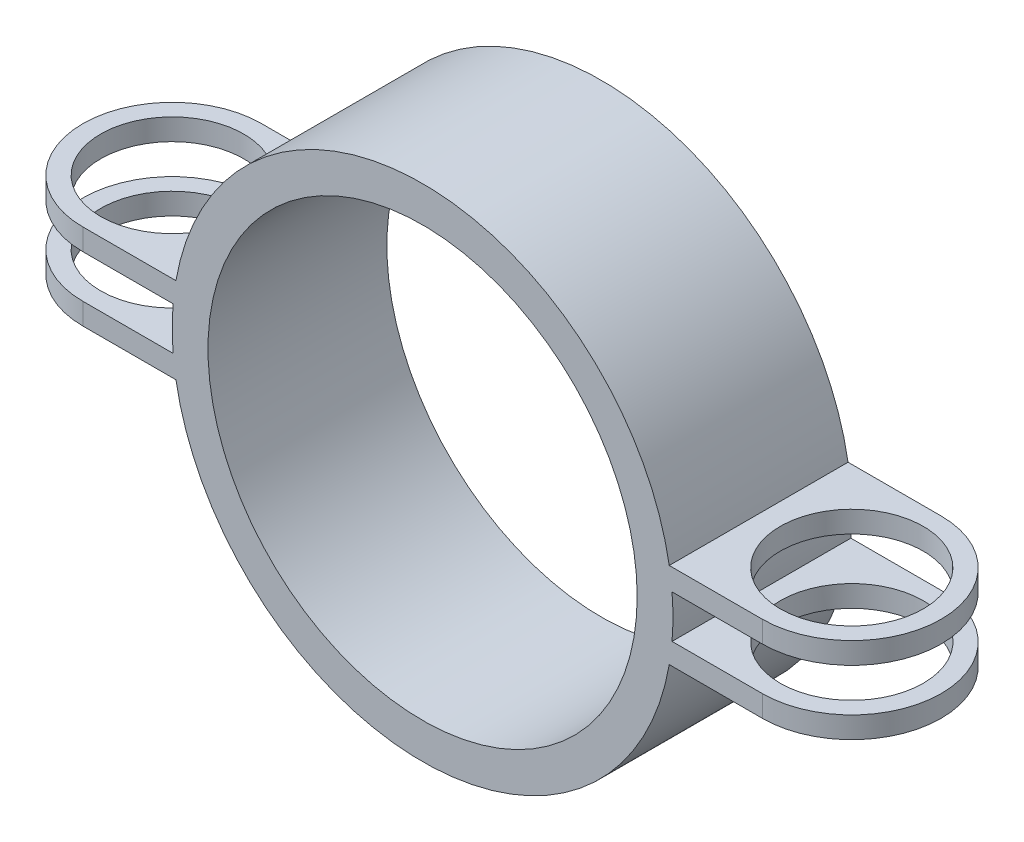
ISO-10303-21;
HEADER;
FILE_DESCRIPTION(('STEP AP214'),'2;1');
FILE_NAME('part.step','',(''),(''),'','','');
FILE_SCHEMA(('AUTOMOTIVE_DESIGN { 1 0 10303 214 1 1 1 1 }'));
ENDSEC;
DATA;
#1=APPLICATION_CONTEXT('core data for automotive mechanical design processes');
#2=APPLICATION_PROTOCOL_DEFINITION('international standard','automotive_design',2000,#1);
#3=PRODUCT_CONTEXT('',#1,'mechanical');
#4=PRODUCT('Part','Part','',(#3));
#5=PRODUCT_RELATED_PRODUCT_CATEGORY('part','',(#4));
#6=PRODUCT_DEFINITION_FORMATION('','',#4);
#7=PRODUCT_DEFINITION_CONTEXT('part definition',#1,'design');
#8=PRODUCT_DEFINITION('design','',#6,#7);
#9=PRODUCT_DEFINITION_SHAPE('','',#8);
#10=(LENGTH_UNIT() NAMED_UNIT(*) SI_UNIT(.MILLI.,.METRE.));
#11=(NAMED_UNIT(*) PLANE_ANGLE_UNIT() SI_UNIT($,.RADIAN.));
#12=(NAMED_UNIT(*) SI_UNIT($,.STERADIAN.) SOLID_ANGLE_UNIT());
#13=UNCERTAINTY_MEASURE_WITH_UNIT(LENGTH_MEASURE(1.E-05),#10,'distance_accuracy_value','');
#14=(GEOMETRIC_REPRESENTATION_CONTEXT(3) GLOBAL_UNCERTAINTY_ASSIGNED_CONTEXT((#13)) GLOBAL_UNIT_ASSIGNED_CONTEXT((#10,
#11,#12)) REPRESENTATION_CONTEXT('',''));
#15=CARTESIAN_POINT('',(0.,0.,0.));
#16=DIRECTION('',(0.,0.,1.));
#17=DIRECTION('',(1.,0.,0.));
#18=AXIS2_PLACEMENT_3D('',#15,#16,#17);
#19=CARTESIAN_POINT('',(0.,0.,-25.));
#20=DIRECTION('',(0.,0.,1.));
#21=DIRECTION('',(1.,0.,0.));
#22=AXIS2_PLACEMENT_3D('',#19,#20,#21);
#23=CYLINDRICAL_SURFACE('',#22,35.);
#24=CARTESIAN_POINT('',(0.,0.,0.));
#25=DIRECTION('',(0.,0.,1.));
#26=DIRECTION('',(1.,0.,0.));
#27=AXIS2_PLACEMENT_3D('',#24,#25,#26);
#28=CIRCLE('',#27,35.);
#29=CARTESIAN_POINT('',(34.8711915483254,-3.,0.));
#30=VERTEX_POINT('',#29);
#31=CARTESIAN_POINT('',(34.8711915483254,3.,0.));
#32=VERTEX_POINT('',#31);
#33=EDGE_CURVE('E282',#30,#32,#28,.T.);
#34=ORIENTED_EDGE('',*,*,#33,.F.);
#35=DIRECTION('',(0.,0.,1.));
#36=VECTOR('',#35,1.);
#37=CARTESIAN_POINT('',(34.8711915483254,-3.,-25.));
#38=LINE('',#37,#36);
#39=CARTESIAN_POINT('',(34.8711915483254,-3.,-25.));
#40=VERTEX_POINT('',#39);
#41=EDGE_CURVE('E52',#40,#30,#38,.T.);
#42=ORIENTED_EDGE('',*,*,#41,.F.);
#43=CARTESIAN_POINT('',(0.,0.,-25.));
#44=DIRECTION('',(0.,0.,1.));
#45=DIRECTION('',(1.,0.,0.));
#46=AXIS2_PLACEMENT_3D('',#43,#44,#45);
#47=CIRCLE('',#46,35.);
#48=CARTESIAN_POINT('',(34.8711915483254,3.,-25.));
#49=VERTEX_POINT('',#48);
#50=EDGE_CURVE('E280',#40,#49,#47,.T.);
#51=ORIENTED_EDGE('',*,*,#50,.T.);
#52=DIRECTION('',(0.,0.,1.));
#53=VECTOR('',#52,1.);
#54=CARTESIAN_POINT('',(34.8711915483254,3.,-25.));
#55=LINE('',#54,#53);
#56=EDGE_CURVE('E202',#32,#49,#55,.F.);
#57=ORIENTED_EDGE('',*,*,#56,.F.);
#58=EDGE_LOOP('',(#34,#42,#51,#57));
#59=FACE_BOUND('',#58,.T.);
#60=ADVANCED_FACE('F36',(#59),#23,.T.);
#61=CARTESIAN_POINT('',(-34.4818792991333,-6.,-25.));
#62=VERTEX_POINT('',#61);
#63=CARTESIAN_POINT('',(34.4818792991333,-6.,-25.));
#64=VERTEX_POINT('',#63);
#65=EDGE_CURVE('E44',#62,#64,#47,.T.);
#66=ORIENTED_EDGE('',*,*,#65,.T.);
#67=DIRECTION('',(0.,0.,1.));
#68=VECTOR('',#67,1.);
#69=CARTESIAN_POINT('',(34.4818792991333,-6.,-25.));
#70=LINE('',#69,#68);
#71=CARTESIAN_POINT('',(34.4818792991333,-6.,0.));
#72=VERTEX_POINT('',#71);
#73=EDGE_CURVE('E182',#72,#64,#70,.F.);
#74=ORIENTED_EDGE('',*,*,#73,.F.);
#75=CARTESIAN_POINT('',(-34.4818792991333,-6.,0.));
#76=VERTEX_POINT('',#75);
#77=EDGE_CURVE('E155',#76,#72,#28,.T.);
#78=ORIENTED_EDGE('',*,*,#77,.F.);
#79=DIRECTION('',(0.,0.,1.));
#80=VECTOR('',#79,1.);
#81=CARTESIAN_POINT('',(-34.4818792991333,-6.,-25.));
#82=LINE('',#81,#80);
#83=EDGE_CURVE('E228',#76,#62,#82,.F.);
#84=ORIENTED_EDGE('',*,*,#83,.T.);
#85=EDGE_LOOP('',(#66,#74,#78,#84));
#86=FACE_BOUND('',#85,.T.);
#87=ADVANCED_FACE('F327',(#86),#23,.T.);
#88=CARTESIAN_POINT('',(34.4818792991333,6.,0.));
#89=VERTEX_POINT('',#88);
#90=CARTESIAN_POINT('',(-34.4818792991333,6.,0.));
#91=VERTEX_POINT('',#90);
#92=EDGE_CURVE('E284',#89,#91,#28,.T.);
#93=ORIENTED_EDGE('',*,*,#92,.F.);
#94=DIRECTION('',(0.,0.,1.));
#95=VECTOR('',#94,1.);
#96=CARTESIAN_POINT('',(34.4818792991333,6.,-25.));
#97=LINE('',#96,#95);
#98=CARTESIAN_POINT('',(34.4818792991333,6.,-25.));
#99=VERTEX_POINT('',#98);
#100=EDGE_CURVE('E60',#99,#89,#97,.T.);
#101=ORIENTED_EDGE('',*,*,#100,.F.);
#102=CARTESIAN_POINT('',(-34.4818792991333,6.,-25.));
#103=VERTEX_POINT('',#102);
#104=EDGE_CURVE('E297',#99,#103,#47,.T.);
#105=ORIENTED_EDGE('',*,*,#104,.T.);
#106=DIRECTION('',(0.,0.,1.));
#107=VECTOR('',#106,1.);
#108=CARTESIAN_POINT('',(-34.4818792991333,6.,-25.));
#109=LINE('',#108,#107);
#110=EDGE_CURVE('E264',#103,#91,#109,.T.);
#111=ORIENTED_EDGE('',*,*,#110,.T.);
#112=EDGE_LOOP('',(#93,#101,#105,#111));
#113=FACE_BOUND('',#112,.T.);
#114=ADVANCED_FACE('F295',(#113),#23,.T.);
#115=DIRECTION('',(0.,0.,1.));
#116=VECTOR('',#115,1.);
#117=CARTESIAN_POINT('',(-34.8711915483254,-3.,-25.));
#118=LINE('',#117,#116);
#119=CARTESIAN_POINT('',(-34.8711915483254,-3.,-25.));
#120=VERTEX_POINT('',#119);
#121=CARTESIAN_POINT('',(-34.8711915483254,-3.,0.));
#122=VERTEX_POINT('',#121);
#123=EDGE_CURVE('E232',#120,#122,#118,.T.);
#124=ORIENTED_EDGE('',*,*,#123,.T.);
#125=CARTESIAN_POINT('',(-34.8711915483254,3.,0.));
#126=VERTEX_POINT('',#125);
#127=EDGE_CURVE('E267',#126,#122,#28,.T.);
#128=ORIENTED_EDGE('',*,*,#127,.F.);
#129=DIRECTION('',(0.,0.,1.));
#130=VECTOR('',#129,1.);
#131=CARTESIAN_POINT('',(-34.8711915483254,3.,-25.));
#132=LINE('',#131,#130);
#133=CARTESIAN_POINT('',(-34.8711915483254,3.,-25.));
#134=VERTEX_POINT('',#133);
#135=EDGE_CURVE('E268',#126,#134,#132,.F.);
#136=ORIENTED_EDGE('',*,*,#135,.T.);
#137=EDGE_CURVE('E281',#134,#120,#47,.T.);
#138=ORIENTED_EDGE('',*,*,#137,.T.);
#139=EDGE_LOOP('',(#124,#128,#136,#138));
#140=FACE_BOUND('',#139,.T.);
#141=ADVANCED_FACE('F312',(#140),#23,.T.);
#142=CARTESIAN_POINT('',(0.,0.,-25.));
#143=DIRECTION('',(0.,0.,1.));
#144=DIRECTION('',(1.,0.,0.));
#145=AXIS2_PLACEMENT_3D('',#142,#143,#144);
#146=CYLINDRICAL_SURFACE('',#145,30.);
#147=CARTESIAN_POINT('',(0.,0.,0.));
#148=DIRECTION('',(0.,0.,-1.));
#149=DIRECTION('',(1.,0.,0.));
#150=AXIS2_PLACEMENT_3D('',#147,#148,#149);
#151=CIRCLE('',#150,30.);
#152=CARTESIAN_POINT('',(30.,0.,0.));
#153=VERTEX_POINT('',#152);
#154=EDGE_CURVE('E39',#153,#153,#151,.T.);
#155=ORIENTED_EDGE('',*,*,#154,.F.);
#156=EDGE_LOOP('',(#155));
#157=FACE_BOUND('',#156,.T.);
#158=CARTESIAN_POINT('',(0.,0.,-25.));
#159=DIRECTION('',(0.,0.,-1.));
#160=DIRECTION('',(1.,0.,0.));
#161=AXIS2_PLACEMENT_3D('',#158,#159,#160);
#162=CIRCLE('',#161,30.);
#163=CARTESIAN_POINT('',(30.,0.,-25.));
#164=VERTEX_POINT('',#163);
#165=EDGE_CURVE('E11',#164,#164,#162,.T.);
#166=ORIENTED_EDGE('',*,*,#165,.T.);
#167=EDGE_LOOP('',(#166));
#168=FACE_BOUND('',#167,.T.);
#169=ADVANCED_FACE('F361',(#157,#168),#146,.F.);
#170=CARTESIAN_POINT('',(0.,0.,-25.));
#171=DIRECTION('',(0.,0.,1.));
#172=DIRECTION('',(1.,0.,0.));
#173=AXIS2_PLACEMENT_3D('',#170,#171,#172);
#174=PLANE('',#173);
#175=ORIENTED_EDGE('',*,*,#165,.F.);
#176=EDGE_LOOP('',(#175));
#177=FACE_BOUND('',#176,.T.);
#178=ORIENTED_EDGE('',*,*,#65,.F.);
#179=DIRECTION('',(-1.,0.,0.));
#180=VECTOR('',#179,1.);
#181=CARTESIAN_POINT('',(0.001000000000001,-6.,-25.));
#182=LINE('',#181,#180);
#183=CARTESIAN_POINT('',(-47.5,-6.,-25.));
#184=VERTEX_POINT('',#183);
#185=EDGE_CURVE('E227',#62,#184,#182,.T.);
#186=ORIENTED_EDGE('',*,*,#185,.T.);
#187=DIRECTION('',(0.,1.,0.));
#188=VECTOR('',#187,1.);
#189=CARTESIAN_POINT('',(-47.5,-6.,-25.));
#190=LINE('',#189,#188);
#191=CARTESIAN_POINT('',(-47.5,-3.,-25.));
#192=VERTEX_POINT('',#191);
#193=EDGE_CURVE('E224',#184,#192,#190,.T.);
#194=ORIENTED_EDGE('',*,*,#193,.T.);
#195=DIRECTION('',(-1.,0.,0.));
#196=VECTOR('',#195,1.);
#197=CARTESIAN_POINT('',(0.001000000000001,-3.,-25.));
#198=LINE('',#197,#196);
#199=EDGE_CURVE('E233',#120,#192,#198,.T.);
#200=ORIENTED_EDGE('',*,*,#199,.F.);
#201=ORIENTED_EDGE('',*,*,#137,.F.);
#202=DIRECTION('',(-1.,0.,0.));
#203=VECTOR('',#202,1.);
#204=CARTESIAN_POINT('',(0.001000000000001,3.,-25.));
#205=LINE('',#204,#203);
#206=CARTESIAN_POINT('',(-47.5,3.,-25.));
#207=VERTEX_POINT('',#206);
#208=EDGE_CURVE('E272',#134,#207,#205,.T.);
#209=ORIENTED_EDGE('',*,*,#208,.T.);
#210=DIRECTION('',(0.,-1.,0.));
#211=VECTOR('',#210,1.);
#212=CARTESIAN_POINT('',(-47.5,6.,-25.));
#213=LINE('',#212,#211);
#214=CARTESIAN_POINT('',(-47.5,6.,-25.));
#215=VERTEX_POINT('',#214);
#216=EDGE_CURVE('E260',#207,#215,#213,.F.);
#217=ORIENTED_EDGE('',*,*,#216,.T.);
#218=DIRECTION('',(-1.,0.,0.));
#219=VECTOR('',#218,1.);
#220=CARTESIAN_POINT('',(0.001000000000001,6.,-25.));
#221=LINE('',#220,#219);
#222=EDGE_CURVE('E274',#103,#215,#221,.T.);
#223=ORIENTED_EDGE('',*,*,#222,.F.);
#224=ORIENTED_EDGE('',*,*,#104,.F.);
#225=DIRECTION('',(1.,0.,0.));
#226=VECTOR('',#225,1.);
#227=CARTESIAN_POINT('',(-60.001,6.,-25.));
#228=LINE('',#227,#226);
#229=CARTESIAN_POINT('',(47.5,6.,-25.));
#230=VERTEX_POINT('',#229);
#231=EDGE_CURVE('E205',#99,#230,#228,.T.);
#232=ORIENTED_EDGE('',*,*,#231,.T.);
#233=DIRECTION('',(0.,-1.,0.));
#234=VECTOR('',#233,1.);
#235=CARTESIAN_POINT('',(47.5,6.,-25.));
#236=LINE('',#235,#234);
#237=CARTESIAN_POINT('',(47.5,3.,-25.));
#238=VERTEX_POINT('',#237);
#239=EDGE_CURVE('E192',#238,#230,#236,.F.);
#240=ORIENTED_EDGE('',*,*,#239,.F.);
#241=DIRECTION('',(1.,0.,0.));
#242=VECTOR('',#241,1.);
#243=CARTESIAN_POINT('',(-60.001,3.,-25.));
#244=LINE('',#243,#242);
#245=EDGE_CURVE('E207',#49,#238,#244,.T.);
#246=ORIENTED_EDGE('',*,*,#245,.F.);
#247=ORIENTED_EDGE('',*,*,#50,.F.);
#248=DIRECTION('',(1.,0.,0.));
#249=VECTOR('',#248,1.);
#250=CARTESIAN_POINT('',(-60.001,-3.,-25.));
#251=LINE('',#250,#249);
#252=CARTESIAN_POINT('',(47.5,-3.,-25.));
#253=VERTEX_POINT('',#252);
#254=EDGE_CURVE('E185',#40,#253,#251,.T.);
#255=ORIENTED_EDGE('',*,*,#254,.T.);
#256=DIRECTION('',(0.,1.,0.));
#257=VECTOR('',#256,1.);
#258=CARTESIAN_POINT('',(47.5,-6.,-25.));
#259=LINE('',#258,#257);
#260=CARTESIAN_POINT('',(47.5,-6.,-25.));
#261=VERTEX_POINT('',#260);
#262=EDGE_CURVE('E174',#261,#253,#259,.T.);
#263=ORIENTED_EDGE('',*,*,#262,.F.);
#264=DIRECTION('',(1.,0.,0.));
#265=VECTOR('',#264,1.);
#266=CARTESIAN_POINT('',(-60.001,-6.,-25.));
#267=LINE('',#266,#265);
#268=EDGE_CURVE('E172',#64,#261,#267,.T.);
#269=ORIENTED_EDGE('',*,*,#268,.F.);
#270=EDGE_LOOP('',(#178,#186,#194,#200,#201,#209,#217,#223,#224,#232,#240,#246,#247,#255,#263,#269));
#271=FACE_BOUND('',#270,.T.);
#272=ADVANCED_FACE('F300',(#177,#271),#174,.F.);
#273=CARTESIAN_POINT('',(0.,0.,0.));
#274=DIRECTION('',(0.,0.,1.));
#275=DIRECTION('',(1.,0.,0.));
#276=AXIS2_PLACEMENT_3D('',#273,#274,#275);
#277=PLANE('',#276);
#278=ORIENTED_EDGE('',*,*,#154,.T.);
#279=EDGE_LOOP('',(#278));
#280=FACE_BOUND('',#279,.T.);
#281=ORIENTED_EDGE('',*,*,#77,.T.);
#282=DIRECTION('',(1.,0.,0.));
#283=VECTOR('',#282,1.);
#284=CARTESIAN_POINT('',(-60.001,-6.,0.));
#285=LINE('',#284,#283);
#286=CARTESIAN_POINT('',(47.5,-6.,0.));
#287=VERTEX_POINT('',#286);
#288=EDGE_CURVE('E150',#72,#287,#285,.T.);
#289=ORIENTED_EDGE('',*,*,#288,.T.);
#290=DIRECTION('',(0.,1.,0.));
#291=VECTOR('',#290,1.);
#292=CARTESIAN_POINT('',(47.5,-6.,0.));
#293=LINE('',#292,#291);
#294=CARTESIAN_POINT('',(47.5,-3.,0.));
#295=VERTEX_POINT('',#294);
#296=EDGE_CURVE('E153',#287,#295,#293,.T.);
#297=ORIENTED_EDGE('',*,*,#296,.T.);
#298=DIRECTION('',(1.,0.,0.));
#299=VECTOR('',#298,1.);
#300=CARTESIAN_POINT('',(-60.001,-3.,0.));
#301=LINE('',#300,#299);
#302=EDGE_CURVE('E180',#30,#295,#301,.T.);
#303=ORIENTED_EDGE('',*,*,#302,.F.);
#304=ORIENTED_EDGE('',*,*,#33,.T.);
#305=DIRECTION('',(1.,0.,0.));
#306=VECTOR('',#305,1.);
#307=CARTESIAN_POINT('',(-60.001,3.,0.));
#308=LINE('',#307,#306);
#309=CARTESIAN_POINT('',(47.5,3.,0.));
#310=VERTEX_POINT('',#309);
#311=EDGE_CURVE('E191',#32,#310,#308,.T.);
#312=ORIENTED_EDGE('',*,*,#311,.T.);
#313=DIRECTION('',(0.,-1.,0.));
#314=VECTOR('',#313,1.);
#315=CARTESIAN_POINT('',(47.5,6.,0.));
#316=LINE('',#315,#314);
#317=CARTESIAN_POINT('',(47.5,6.,0.));
#318=VERTEX_POINT('',#317);
#319=EDGE_CURVE('E181',#310,#318,#316,.F.);
#320=ORIENTED_EDGE('',*,*,#319,.T.);
#321=DIRECTION('',(1.,0.,0.));
#322=VECTOR('',#321,1.);
#323=CARTESIAN_POINT('',(-60.001,6.,0.));
#324=LINE('',#323,#322);
#325=EDGE_CURVE('E203',#89,#318,#324,.T.);
#326=ORIENTED_EDGE('',*,*,#325,.F.);
#327=ORIENTED_EDGE('',*,*,#92,.T.);
#328=DIRECTION('',(-1.,0.,0.));
#329=VECTOR('',#328,1.);
#330=CARTESIAN_POINT('',(0.001000000000001,6.,0.));
#331=LINE('',#330,#329);
#332=CARTESIAN_POINT('',(-47.5,6.,0.));
#333=VERTEX_POINT('',#332);
#334=EDGE_CURVE('E263',#91,#333,#331,.T.);
#335=ORIENTED_EDGE('',*,*,#334,.T.);
#336=DIRECTION('',(0.,-1.,0.));
#337=VECTOR('',#336,1.);
#338=CARTESIAN_POINT('',(-47.5,6.,0.));
#339=LINE('',#338,#337);
#340=CARTESIAN_POINT('',(-47.5,3.,0.));
#341=VERTEX_POINT('',#340);
#342=EDGE_CURVE('E255',#341,#333,#339,.F.);
#343=ORIENTED_EDGE('',*,*,#342,.F.);
#344=DIRECTION('',(-1.,0.,0.));
#345=VECTOR('',#344,1.);
#346=CARTESIAN_POINT('',(0.001000000000001,3.,0.));
#347=LINE('',#346,#345);
#348=EDGE_CURVE('E269',#126,#341,#347,.T.);
#349=ORIENTED_EDGE('',*,*,#348,.F.);
#350=ORIENTED_EDGE('',*,*,#127,.T.);
#351=DIRECTION('',(-1.,0.,0.));
#352=VECTOR('',#351,1.);
#353=CARTESIAN_POINT('',(0.001000000000001,-3.,0.));
#354=LINE('',#353,#352);
#355=CARTESIAN_POINT('',(-47.5,-3.,0.));
#356=VERTEX_POINT('',#355);
#357=EDGE_CURVE('E236',#122,#356,#354,.T.);
#358=ORIENTED_EDGE('',*,*,#357,.T.);
#359=DIRECTION('',(0.,1.,0.));
#360=VECTOR('',#359,1.);
#361=CARTESIAN_POINT('',(-47.5,-6.,0.));
#362=LINE('',#361,#360);
#363=CARTESIAN_POINT('',(-47.5,-6.,0.));
#364=VERTEX_POINT('',#363);
#365=EDGE_CURVE('E220',#364,#356,#362,.T.);
#366=ORIENTED_EDGE('',*,*,#365,.F.);
#367=DIRECTION('',(-1.,0.,0.));
#368=VECTOR('',#367,1.);
#369=CARTESIAN_POINT('',(0.001000000000001,-6.,0.));
#370=LINE('',#369,#368);
#371=EDGE_CURVE('E239',#76,#364,#370,.T.);
#372=ORIENTED_EDGE('',*,*,#371,.F.);
#373=EDGE_LOOP('',(#281,#289,#297,#303,#304,#312,#320,#326,#327,#335,#343,#349,#350,#358,#366,#372));
#374=FACE_BOUND('',#373,.T.);
#375=ADVANCED_FACE('F152',(#280,#374),#277,.T.);
#376=CARTESIAN_POINT('',(0.001000000000001,3.,-25.));
#377=DIRECTION('',(0.,-1.,0.));
#378=DIRECTION('',(0.,0.,-1.));
#379=AXIS2_PLACEMENT_3D('',#376,#377,#378);
#380=PLANE('',#379);
#381=ORIENTED_EDGE('',*,*,#135,.F.);
#382=ORIENTED_EDGE('',*,*,#348,.T.);
#383=CARTESIAN_POINT('',(-47.5,3.,-12.5));
#384=DIRECTION('',(0.,1.,0.));
#385=DIRECTION('',(0.,0.,1.));
#386=AXIS2_PLACEMENT_3D('',#383,#384,#385);
#387=CIRCLE('',#386,12.5);
#388=EDGE_CURVE('E249',#207,#341,#387,.T.);
#389=ORIENTED_EDGE('',*,*,#388,.F.);
#390=ORIENTED_EDGE('',*,*,#208,.F.);
#391=EDGE_LOOP('',(#381,#382,#389,#390));
#392=FACE_BOUND('',#391,.T.);
#393=CARTESIAN_POINT('',(-47.5,3.,-12.5));
#394=DIRECTION('',(0.,1.,0.));
#395=DIRECTION('',(0.,0.,1.));
#396=AXIS2_PLACEMENT_3D('',#393,#394,#395);
#397=CIRCLE('',#396,9.99999999999999);
#398=CARTESIAN_POINT('',(-47.5,3.,-2.50000000000001));
#399=VERTEX_POINT('',#398);
#400=EDGE_CURVE('E231',#399,#399,#397,.T.);
#401=ORIENTED_EDGE('',*,*,#400,.T.);
#402=EDGE_LOOP('',(#401));
#403=FACE_BOUND('',#402,.T.);
#404=ADVANCED_FACE('F308',(#392,#403),#380,.T.);
#405=CARTESIAN_POINT('',(0.001000000000001,6.,-25.));
#406=DIRECTION('',(0.,1.,0.));
#407=DIRECTION('',(0.,0.,1.));
#408=AXIS2_PLACEMENT_3D('',#405,#406,#407);
#409=PLANE('',#408);
#410=ORIENTED_EDGE('',*,*,#110,.F.);
#411=ORIENTED_EDGE('',*,*,#222,.T.);
#412=CARTESIAN_POINT('',(-47.5,6.,-12.5));
#413=DIRECTION('',(0.,1.,0.));
#414=DIRECTION('',(0.,0.,1.));
#415=AXIS2_PLACEMENT_3D('',#412,#413,#414);
#416=CIRCLE('',#415,12.5);
#417=EDGE_CURVE('E252',#215,#333,#416,.T.);
#418=ORIENTED_EDGE('',*,*,#417,.T.);
#419=ORIENTED_EDGE('',*,*,#334,.F.);
#420=EDGE_LOOP('',(#410,#411,#418,#419));
#421=FACE_BOUND('',#420,.T.);
#422=CARTESIAN_POINT('',(-47.5,6.,-12.5));
#423=DIRECTION('',(0.,1.,0.));
#424=DIRECTION('',(0.,0.,1.));
#425=AXIS2_PLACEMENT_3D('',#422,#423,#424);
#426=CIRCLE('',#425,9.99999999999999);
#427=CARTESIAN_POINT('',(-47.5,6.,-2.50000000000001));
#428=VERTEX_POINT('',#427);
#429=EDGE_CURVE('E246',#428,#428,#426,.T.);
#430=ORIENTED_EDGE('',*,*,#429,.F.);
#431=EDGE_LOOP('',(#430));
#432=FACE_BOUND('',#431,.T.);
#433=ADVANCED_FACE('F292',(#421,#432),#409,.T.);
#434=CARTESIAN_POINT('',(-47.5,6.,-12.5));
#435=DIRECTION('',(0.,-1.,0.));
#436=DIRECTION('',(0.,0.,-1.));
#437=AXIS2_PLACEMENT_3D('',#434,#435,#436);
#438=CYLINDRICAL_SURFACE('',#437,12.5);
#439=ORIENTED_EDGE('',*,*,#216,.F.);
#440=ORIENTED_EDGE('',*,*,#388,.T.);
#441=ORIENTED_EDGE('',*,*,#342,.T.);
#442=ORIENTED_EDGE('',*,*,#417,.F.);
#443=EDGE_LOOP('',(#439,#440,#441,#442));
#444=FACE_BOUND('',#443,.T.);
#445=ADVANCED_FACE('F305',(#444),#438,.T.);
#446=CARTESIAN_POINT('',(-47.5,6.,-12.5));
#447=DIRECTION('',(0.,-1.,0.));
#448=DIRECTION('',(0.,0.,-1.));
#449=AXIS2_PLACEMENT_3D('',#446,#447,#448);
#450=CYLINDRICAL_SURFACE('',#449,9.99999999999999);
#451=ORIENTED_EDGE('',*,*,#429,.T.);
#452=EDGE_LOOP('',(#451));
#453=FACE_BOUND('',#452,.T.);
#454=ORIENTED_EDGE('',*,*,#400,.F.);
#455=EDGE_LOOP('',(#454));
#456=FACE_BOUND('',#455,.T.);
#457=ADVANCED_FACE('F420',(#453,#456),#450,.F.);
#458=CARTESIAN_POINT('',(0.001000000000001,-3.,0.));
#459=DIRECTION('',(0.,1.,0.));
#460=DIRECTION('',(0.,0.,1.));
#461=AXIS2_PLACEMENT_3D('',#458,#459,#460);
#462=PLANE('',#461);
#463=ORIENTED_EDGE('',*,*,#123,.F.);
#464=ORIENTED_EDGE('',*,*,#199,.T.);
#465=CARTESIAN_POINT('',(-47.5,-3.,-12.5));
#466=DIRECTION('',(0.,1.,0.));
#467=DIRECTION('',(0.,0.,1.));
#468=AXIS2_PLACEMENT_3D('',#465,#466,#467);
#469=CIRCLE('',#468,12.5);
#470=EDGE_CURVE('E215',#192,#356,#469,.T.);
#471=ORIENTED_EDGE('',*,*,#470,.T.);
#472=ORIENTED_EDGE('',*,*,#357,.F.);
#473=EDGE_LOOP('',(#463,#464,#471,#472));
#474=FACE_BOUND('',#473,.T.);
#475=CARTESIAN_POINT('',(-47.5,-3.,-12.5));
#476=DIRECTION('',(0.,1.,0.));
#477=DIRECTION('',(0.,0.,1.));
#478=AXIS2_PLACEMENT_3D('',#475,#476,#477);
#479=CIRCLE('',#478,9.99999999999999);
#480=CARTESIAN_POINT('',(-47.5,-3.,-2.50000000000001));
#481=VERTEX_POINT('',#480);
#482=EDGE_CURVE('E201',#481,#481,#479,.T.);
#483=ORIENTED_EDGE('',*,*,#482,.F.);
#484=EDGE_LOOP('',(#483));
#485=FACE_BOUND('',#484,.T.);
#486=ADVANCED_FACE('F315',(#474,#485),#462,.T.);
#487=CARTESIAN_POINT('',(0.001000000000001,-6.,0.));
#488=DIRECTION('',(0.,-1.,0.));
#489=DIRECTION('',(0.,0.,-1.));
#490=AXIS2_PLACEMENT_3D('',#487,#488,#489);
#491=PLANE('',#490);
#492=ORIENTED_EDGE('',*,*,#83,.F.);
#493=ORIENTED_EDGE('',*,*,#371,.T.);
#494=CARTESIAN_POINT('',(-47.5,-6.,-12.5));
#495=DIRECTION('',(0.,1.,0.));
#496=DIRECTION('',(0.,0.,1.));
#497=AXIS2_PLACEMENT_3D('',#494,#495,#496);
#498=CIRCLE('',#497,12.5);
#499=EDGE_CURVE('E218',#184,#364,#498,.T.);
#500=ORIENTED_EDGE('',*,*,#499,.F.);
#501=ORIENTED_EDGE('',*,*,#185,.F.);
#502=EDGE_LOOP('',(#492,#493,#500,#501));
#503=FACE_BOUND('',#502,.T.);
#504=CARTESIAN_POINT('',(-47.5,-6.,-12.5));
#505=DIRECTION('',(0.,1.,0.));
#506=DIRECTION('',(0.,0.,1.));
#507=AXIS2_PLACEMENT_3D('',#504,#505,#506);
#508=CIRCLE('',#507,9.99999999999999);
#509=CARTESIAN_POINT('',(-47.5,-6.,-2.50000000000001));
#510=VERTEX_POINT('',#509);
#511=EDGE_CURVE('E212',#510,#510,#508,.T.);
#512=ORIENTED_EDGE('',*,*,#511,.T.);
#513=EDGE_LOOP('',(#512));
#514=FACE_BOUND('',#513,.T.);
#515=ADVANCED_FACE('F323',(#503,#514),#491,.T.);
#516=CARTESIAN_POINT('',(-47.5,-6.,-12.5));
#517=DIRECTION('',(0.,1.,0.));
#518=DIRECTION('',(0.,0.,1.));
#519=AXIS2_PLACEMENT_3D('',#516,#517,#518);
#520=CYLINDRICAL_SURFACE('',#519,12.5);
#521=ORIENTED_EDGE('',*,*,#193,.F.);
#522=ORIENTED_EDGE('',*,*,#499,.T.);
#523=ORIENTED_EDGE('',*,*,#365,.T.);
#524=ORIENTED_EDGE('',*,*,#470,.F.);
#525=EDGE_LOOP('',(#521,#522,#523,#524));
#526=FACE_BOUND('',#525,.T.);
#527=ADVANCED_FACE('F320',(#526),#520,.T.);
#528=CARTESIAN_POINT('',(-47.5,-6.,-12.5));
#529=DIRECTION('',(0.,1.,0.));
#530=DIRECTION('',(0.,0.,1.));
#531=AXIS2_PLACEMENT_3D('',#528,#529,#530);
#532=CYLINDRICAL_SURFACE('',#531,9.99999999999999);
#533=ORIENTED_EDGE('',*,*,#511,.F.);
#534=EDGE_LOOP('',(#533));
#535=FACE_BOUND('',#534,.T.);
#536=ORIENTED_EDGE('',*,*,#482,.T.);
#537=EDGE_LOOP('',(#536));
#538=FACE_BOUND('',#537,.T.);
#539=ADVANCED_FACE('F352',(#535,#538),#532,.F.);
#540=CARTESIAN_POINT('',(-60.001,3.,-25.));
#541=DIRECTION('',(0.,1.,0.));
#542=DIRECTION('',(0.,0.,1.));
#543=AXIS2_PLACEMENT_3D('',#540,#541,#542);
#544=PLANE('',#543);
#545=CARTESIAN_POINT('',(47.5,3.,-12.5));
#546=DIRECTION('',(0.,1.,0.));
#547=DIRECTION('',(0.,0.,1.));
#548=AXIS2_PLACEMENT_3D('',#545,#546,#547);
#549=CIRCLE('',#548,9.99999999999999);
#550=CARTESIAN_POINT('',(47.5,3.,-2.50000000000001));
#551=VERTEX_POINT('',#550);
#552=EDGE_CURVE('E178',#551,#551,#549,.T.);
#553=ORIENTED_EDGE('',*,*,#552,.T.);
#554=EDGE_LOOP('',(#553));
#555=FACE_BOUND('',#554,.T.);
#556=ORIENTED_EDGE('',*,*,#311,.F.);
#557=ORIENTED_EDGE('',*,*,#56,.T.);
#558=ORIENTED_EDGE('',*,*,#245,.T.);
#559=CARTESIAN_POINT('',(47.5,3.,-12.5));
#560=DIRECTION('',(0.,-1.,0.));
#561=DIRECTION('',(0.,0.,1.));
#562=AXIS2_PLACEMENT_3D('',#559,#560,#561);
#563=CIRCLE('',#562,12.5);
#564=EDGE_CURVE('E195',#238,#310,#563,.T.);
#565=ORIENTED_EDGE('',*,*,#564,.T.);
#566=EDGE_LOOP('',(#556,#557,#558,#565));
#567=FACE_BOUND('',#566,.T.);
#568=ADVANCED_FACE('F336',(#555,#567),#544,.F.);
#569=CARTESIAN_POINT('',(-60.001,6.,-25.));
#570=DIRECTION('',(0.,-1.,0.));
#571=DIRECTION('',(0.,0.,-1.));
#572=AXIS2_PLACEMENT_3D('',#569,#570,#571);
#573=PLANE('',#572);
#574=CARTESIAN_POINT('',(47.5,6.,-12.5));
#575=DIRECTION('',(0.,1.,0.));
#576=DIRECTION('',(0.,0.,1.));
#577=AXIS2_PLACEMENT_3D('',#574,#575,#576);
#578=CIRCLE('',#577,9.99999999999999);
#579=CARTESIAN_POINT('',(47.5,6.,-2.50000000000001));
#580=VERTEX_POINT('',#579);
#581=EDGE_CURVE('E562',#580,#580,#578,.T.);
#582=ORIENTED_EDGE('',*,*,#581,.F.);
#583=EDGE_LOOP('',(#582));
#584=FACE_BOUND('',#583,.T.);
#585=ORIENTED_EDGE('',*,*,#231,.F.);
#586=ORIENTED_EDGE('',*,*,#100,.T.);
#587=ORIENTED_EDGE('',*,*,#325,.T.);
#588=CARTESIAN_POINT('',(47.5,6.,-12.5));
#589=DIRECTION('',(0.,-1.,0.));
#590=DIRECTION('',(0.,0.,1.));
#591=AXIS2_PLACEMENT_3D('',#588,#589,#590);
#592=CIRCLE('',#591,12.5);
#593=EDGE_CURVE('E188',#230,#318,#592,.T.);
#594=ORIENTED_EDGE('',*,*,#593,.F.);
#595=EDGE_LOOP('',(#585,#586,#587,#594));
#596=FACE_BOUND('',#595,.T.);
#597=ADVANCED_FACE('F343',(#584,#596),#573,.F.);
#598=CARTESIAN_POINT('',(47.5,6.,-12.5));
#599=DIRECTION('',(0.,-1.,0.));
#600=DIRECTION('',(0.,0.,-1.));
#601=AXIS2_PLACEMENT_3D('',#598,#599,#600);
#602=CYLINDRICAL_SURFACE('',#601,12.5);
#603=ORIENTED_EDGE('',*,*,#239,.T.);
#604=ORIENTED_EDGE('',*,*,#593,.T.);
#605=ORIENTED_EDGE('',*,*,#319,.F.);
#606=ORIENTED_EDGE('',*,*,#564,.F.);
#607=EDGE_LOOP('',(#603,#604,#605,#606));
#608=FACE_BOUND('',#607,.T.);
#609=ADVANCED_FACE('F342',(#608),#602,.T.);
#610=CARTESIAN_POINT('',(-60.001,-3.,0.));
#611=DIRECTION('',(0.,-1.,0.));
#612=DIRECTION('',(0.,0.,-1.));
#613=AXIS2_PLACEMENT_3D('',#610,#611,#612);
#614=PLANE('',#613);
#615=CARTESIAN_POINT('',(47.5,-3.,-12.5));
#616=DIRECTION('',(0.,-1.,0.));
#617=DIRECTION('',(0.,0.,-1.));
#618=AXIS2_PLACEMENT_3D('',#615,#616,#617);
#619=CIRCLE('',#618,9.99999999999999);
#620=CARTESIAN_POINT('',(47.5,-3.,-22.5));
#621=VERTEX_POINT('',#620);
#622=EDGE_CURVE('E565',#621,#621,#619,.T.);
#623=ORIENTED_EDGE('',*,*,#622,.T.);
#624=EDGE_LOOP('',(#623));
#625=FACE_BOUND('',#624,.T.);
#626=ORIENTED_EDGE('',*,*,#254,.F.);
#627=ORIENTED_EDGE('',*,*,#41,.T.);
#628=ORIENTED_EDGE('',*,*,#302,.T.);
#629=CARTESIAN_POINT('',(47.5,-3.,-12.5));
#630=DIRECTION('',(0.,-1.,0.));
#631=DIRECTION('',(0.,0.,1.));
#632=AXIS2_PLACEMENT_3D('',#629,#630,#631);
#633=CIRCLE('',#632,12.5);
#634=EDGE_CURVE('E169',#253,#295,#633,.T.);
#635=ORIENTED_EDGE('',*,*,#634,.F.);
#636=EDGE_LOOP('',(#626,#627,#628,#635));
#637=FACE_BOUND('',#636,.T.);
#638=ADVANCED_FACE('F329',(#625,#637),#614,.F.);
#639=CARTESIAN_POINT('',(-60.001,-6.,0.));
#640=DIRECTION('',(0.,1.,0.));
#641=DIRECTION('',(0.,0.,1.));
#642=AXIS2_PLACEMENT_3D('',#639,#640,#641);
#643=PLANE('',#642);
#644=CARTESIAN_POINT('',(47.5,-6.,-12.5));
#645=DIRECTION('',(0.,1.,0.));
#646=DIRECTION('',(0.,0.,1.));
#647=AXIS2_PLACEMENT_3D('',#644,#645,#646);
#648=CIRCLE('',#647,9.99999999999999);
#649=CARTESIAN_POINT('',(47.5,-6.,-2.50000000000001));
#650=VERTEX_POINT('',#649);
#651=EDGE_CURVE('E568',#650,#650,#648,.F.);
#652=ORIENTED_EDGE('',*,*,#651,.F.);
#653=EDGE_LOOP('',(#652));
#654=FACE_BOUND('',#653,.T.);
#655=ORIENTED_EDGE('',*,*,#288,.F.);
#656=ORIENTED_EDGE('',*,*,#73,.T.);
#657=ORIENTED_EDGE('',*,*,#268,.T.);
#658=CARTESIAN_POINT('',(47.5,-6.,-12.5));
#659=DIRECTION('',(0.,-1.,0.));
#660=DIRECTION('',(0.,0.,1.));
#661=AXIS2_PLACEMENT_3D('',#658,#659,#660);
#662=CIRCLE('',#661,12.5);
#663=EDGE_CURVE('E166',#261,#287,#662,.T.);
#664=ORIENTED_EDGE('',*,*,#663,.T.);
#665=EDGE_LOOP('',(#655,#656,#657,#664));
#666=FACE_BOUND('',#665,.T.);
#667=ADVANCED_FACE('F171',(#654,#666),#643,.F.);
#668=CARTESIAN_POINT('',(47.5,-6.,-12.5));
#669=DIRECTION('',(0.,1.,0.));
#670=DIRECTION('',(0.,0.,1.));
#671=AXIS2_PLACEMENT_3D('',#668,#669,#670);
#672=CYLINDRICAL_SURFACE('',#671,12.5);
#673=ORIENTED_EDGE('',*,*,#262,.T.);
#674=ORIENTED_EDGE('',*,*,#634,.T.);
#675=ORIENTED_EDGE('',*,*,#296,.F.);
#676=ORIENTED_EDGE('',*,*,#663,.F.);
#677=EDGE_LOOP('',(#673,#674,#675,#676));
#678=FACE_BOUND('',#677,.T.);
#679=ADVANCED_FACE('F165',(#678),#672,.T.);
#680=CARTESIAN_POINT('',(47.5,-34.2842712474619,-12.5));
#681=DIRECTION('',(0.,1.,0.));
#682=DIRECTION('',(0.,0.,1.));
#683=AXIS2_PLACEMENT_3D('',#680,#681,#682);
#684=CYLINDRICAL_SURFACE('',#683,9.99999999999999);
#685=ORIENTED_EDGE('',*,*,#651,.T.);
#686=EDGE_LOOP('',(#685));
#687=FACE_BOUND('',#686,.T.);
#688=ORIENTED_EDGE('',*,*,#622,.F.);
#689=EDGE_LOOP('',(#688));
#690=FACE_BOUND('',#689,.T.);
#691=ADVANCED_FACE('F511',(#687,#690),#684,.F.);
#692=ORIENTED_EDGE('',*,*,#581,.T.);
#693=EDGE_LOOP('',(#692));
#694=FACE_BOUND('',#693,.T.);
#695=ORIENTED_EDGE('',*,*,#552,.F.);
#696=EDGE_LOOP('',(#695));
#697=FACE_BOUND('',#696,.T.);
#698=ADVANCED_FACE('F545',(#694,#697),#684,.F.);
#699=CLOSED_SHELL('',(#60,#87,#114,#141,#169,#272,#375,#404,#433,#445,#457,#486,#515,#527,#539,
#568,#597,#609,#638,#667,#679,#691,#698));
#700=MANIFOLD_SOLID_BREP('B2',#699);
#701=ADVANCED_BREP_SHAPE_REPRESENTATION('',(#18,#700),#14);
#702=SHAPE_DEFINITION_REPRESENTATION(#9,#701);
ENDSEC;
END-ISO-10303-21;
